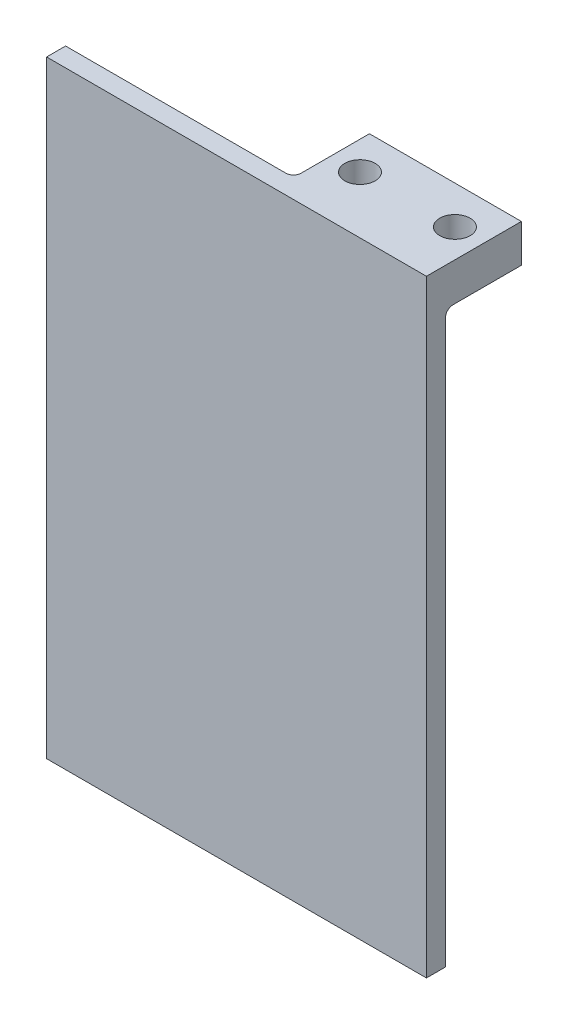
ISO-10303-21;
HEADER;
FILE_DESCRIPTION(('STEP AP214'),'2;1');
FILE_NAME('part.step','',(''),(''),'','','');
FILE_SCHEMA(('AUTOMOTIVE_DESIGN { 1 0 10303 214 1 1 1 1 }'));
ENDSEC;
DATA;
#1=APPLICATION_CONTEXT('core data for automotive mechanical design processes');
#2=APPLICATION_PROTOCOL_DEFINITION('international standard','automotive_design',2000,#1);
#3=PRODUCT_CONTEXT('',#1,'mechanical');
#4=PRODUCT('Part','Part','',(#3));
#5=PRODUCT_RELATED_PRODUCT_CATEGORY('part','',(#4));
#6=PRODUCT_DEFINITION_FORMATION('','',#4);
#7=PRODUCT_DEFINITION_CONTEXT('part definition',#1,'design');
#8=PRODUCT_DEFINITION('design','',#6,#7);
#9=PRODUCT_DEFINITION_SHAPE('','',#8);
#10=(LENGTH_UNIT() NAMED_UNIT(*) SI_UNIT(.MILLI.,.METRE.));
#11=(NAMED_UNIT(*) PLANE_ANGLE_UNIT() SI_UNIT($,.RADIAN.));
#12=(NAMED_UNIT(*) SI_UNIT($,.STERADIAN.) SOLID_ANGLE_UNIT());
#13=UNCERTAINTY_MEASURE_WITH_UNIT(LENGTH_MEASURE(1.E-05),#10,'distance_accuracy_value','');
#14=(GEOMETRIC_REPRESENTATION_CONTEXT(3) GLOBAL_UNCERTAINTY_ASSIGNED_CONTEXT((#13)) GLOBAL_UNIT_ASSIGNED_CONTEXT((#10,
#11,#12)) REPRESENTATION_CONTEXT('',''));
#15=CARTESIAN_POINT('',(0.,0.,0.));
#16=DIRECTION('',(0.,0.,1.));
#17=DIRECTION('',(1.,0.,0.));
#18=AXIS2_PLACEMENT_3D('',#15,#16,#17);
#19=CARTESIAN_POINT('',(0.,0.,0.));
#20=DIRECTION('',(0.,0.,1.));
#21=DIRECTION('',(1.,0.,0.));
#22=AXIS2_PLACEMENT_3D('',#19,#20,#21);
#23=PLANE('',#22);
#24=DIRECTION('',(0.,1.,0.));
#25=VECTOR('',#24,1.);
#26=CARTESIAN_POINT('',(7.99999999999999,0.,0.));
#27=LINE('',#26,#25);
#28=CARTESIAN_POINT('',(7.99999999999999,80.,0.));
#29=VERTEX_POINT('',#28);
#30=CARTESIAN_POINT('',(7.99999999999999,68.,0.));
#31=VERTEX_POINT('',#30);
#32=EDGE_CURVE('E185',#29,#31,#27,.F.);
#33=ORIENTED_EDGE('',*,*,#32,.T.);
#34=DIRECTION('',(1.,0.,0.));
#35=VECTOR('',#34,1.);
#36=CARTESIAN_POINT('',(50.,68.,0.));
#37=LINE('',#36,#35);
#38=CARTESIAN_POINT('',(50.,68.,0.));
#39=VERTEX_POINT('',#38);
#40=EDGE_CURVE('E188',#31,#39,#37,.T.);
#41=ORIENTED_EDGE('',*,*,#40,.T.);
#42=DIRECTION('',(0.,1.,0.));
#43=VECTOR('',#42,1.);
#44=CARTESIAN_POINT('',(50.,80.,0.));
#45=LINE('',#44,#43);
#46=CARTESIAN_POINT('',(50.,-80.,0.));
#47=VERTEX_POINT('',#46);
#48=EDGE_CURVE('E144',#47,#39,#45,.T.);
#49=ORIENTED_EDGE('',*,*,#48,.F.);
#50=DIRECTION('',(1.,0.,0.));
#51=VECTOR('',#50,1.);
#52=CARTESIAN_POINT('',(-50.,-80.,0.));
#53=LINE('',#52,#51);
#54=CARTESIAN_POINT('',(-50.,-80.,0.));
#55=VERTEX_POINT('',#54);
#56=EDGE_CURVE('E151',#55,#47,#53,.T.);
#57=ORIENTED_EDGE('',*,*,#56,.F.);
#58=DIRECTION('',(0.,-1.,0.));
#59=VECTOR('',#58,1.);
#60=CARTESIAN_POINT('',(-50.,80.,0.));
#61=LINE('',#60,#59);
#62=CARTESIAN_POINT('',(-50.,80.,0.));
#63=VERTEX_POINT('',#62);
#64=EDGE_CURVE('E166',#63,#55,#61,.T.);
#65=ORIENTED_EDGE('',*,*,#64,.F.);
#66=DIRECTION('',(-1.,0.,0.));
#67=VECTOR('',#66,1.);
#68=CARTESIAN_POINT('',(-50.,80.,0.));
#69=LINE('',#68,#67);
#70=EDGE_CURVE('E163',#29,#63,#69,.T.);
#71=ORIENTED_EDGE('',*,*,#70,.F.);
#72=EDGE_LOOP('',(#33,#41,#49,#57,#65,#71));
#73=FACE_BOUND('',#72,.T.);
#74=ADVANCED_FACE('F39',(#73),#23,.F.);
#75=CARTESIAN_POINT('',(50.,80.,5.));
#76=DIRECTION('',(-1.,0.,0.));
#77=DIRECTION('',(0.,0.,1.));
#78=AXIS2_PLACEMENT_3D('',#75,#76,#77);
#79=PLANE('',#78);
#80=ORIENTED_EDGE('',*,*,#48,.T.);
#81=CARTESIAN_POINT('',(50.,68.,-2.));
#82=DIRECTION('',(-1.,0.,0.));
#83=DIRECTION('',(0.,0.,1.));
#84=AXIS2_PLACEMENT_3D('',#81,#82,#83);
#85=CIRCLE('',#84,2.);
#86=CARTESIAN_POINT('',(50.,70.,-2.));
#87=VERTEX_POINT('',#86);
#88=EDGE_CURVE('E49',#39,#87,#85,.T.);
#89=ORIENTED_EDGE('',*,*,#88,.T.);
#90=DIRECTION('',(0.,0.,-1.));
#91=VECTOR('',#90,1.);
#92=CARTESIAN_POINT('',(50.,70.,0.));
#93=LINE('',#92,#91);
#94=CARTESIAN_POINT('',(50.,70.,-20.));
#95=VERTEX_POINT('',#94);
#96=EDGE_CURVE('E110',#87,#95,#93,.T.);
#97=ORIENTED_EDGE('',*,*,#96,.T.);
#98=DIRECTION('',(0.,1.,0.));
#99=VECTOR('',#98,1.);
#100=CARTESIAN_POINT('',(50.,70.,-20.));
#101=LINE('',#100,#99);
#102=CARTESIAN_POINT('',(50.,80.,-20.));
#103=VERTEX_POINT('',#102);
#104=EDGE_CURVE('E115',#95,#103,#101,.T.);
#105=ORIENTED_EDGE('',*,*,#104,.T.);
#106=DIRECTION('',(0.,0.,-1.));
#107=VECTOR('',#106,1.);
#108=CARTESIAN_POINT('',(50.,80.,5.));
#109=LINE('',#108,#107);
#110=CARTESIAN_POINT('',(50.,80.,5.));
#111=VERTEX_POINT('',#110);
#112=EDGE_CURVE('E182',#111,#103,#109,.T.);
#113=ORIENTED_EDGE('',*,*,#112,.F.);
#114=DIRECTION('',(0.,1.,0.));
#115=VECTOR('',#114,1.);
#116=CARTESIAN_POINT('',(50.,80.,5.));
#117=LINE('',#116,#115);
#118=CARTESIAN_POINT('',(50.,-80.,5.));
#119=VERTEX_POINT('',#118);
#120=EDGE_CURVE('E146',#119,#111,#117,.T.);
#121=ORIENTED_EDGE('',*,*,#120,.F.);
#122=DIRECTION('',(0.,0.,-1.));
#123=VECTOR('',#122,1.);
#124=CARTESIAN_POINT('',(50.,-80.,5.));
#125=LINE('',#124,#123);
#126=EDGE_CURVE('E160',#119,#47,#125,.T.);
#127=ORIENTED_EDGE('',*,*,#126,.T.);
#128=EDGE_LOOP('',(#80,#89,#97,#105,#113,#121,#127));
#129=FACE_BOUND('',#128,.T.);
#130=ADVANCED_FACE('F113',(#129),#79,.F.);
#131=CARTESIAN_POINT('',(-50.,80.,5.));
#132=DIRECTION('',(0.,-1.,0.));
#133=DIRECTION('',(0.,0.,-1.));
#134=AXIS2_PLACEMENT_3D('',#131,#132,#133);
#135=PLANE('',#134);
#136=CARTESIAN_POINT('',(17.5,80.,-9.99999999999999));
#137=DIRECTION('',(0.,1.,0.));
#138=DIRECTION('',(0.,0.,1.));
#139=AXIS2_PLACEMENT_3D('',#136,#137,#138);
#140=CIRCLE('',#139,4.);
#141=CARTESIAN_POINT('',(17.5,80.,-6.));
#142=VERTEX_POINT('',#141);
#143=EDGE_CURVE('E230',#142,#142,#140,.T.);
#144=ORIENTED_EDGE('',*,*,#143,.F.);
#145=EDGE_LOOP('',(#144));
#146=FACE_BOUND('',#145,.T.);
#147=CARTESIAN_POINT('',(42.5,80.,-9.99999999999999));
#148=DIRECTION('',(0.,1.,0.));
#149=DIRECTION('',(0.,0.,1.));
#150=AXIS2_PLACEMENT_3D('',#147,#148,#149);
#151=CIRCLE('',#150,4.00000000000001);
#152=CARTESIAN_POINT('',(42.5,80.,-5.99999999999999));
#153=VERTEX_POINT('',#152);
#154=EDGE_CURVE('E222',#153,#153,#151,.T.);
#155=ORIENTED_EDGE('',*,*,#154,.F.);
#156=EDGE_LOOP('',(#155));
#157=FACE_BOUND('',#156,.T.);
#158=ORIENTED_EDGE('',*,*,#112,.T.);
#159=DIRECTION('',(-1.,0.,0.));
#160=VECTOR('',#159,1.);
#161=CARTESIAN_POINT('',(50.,80.,-20.));
#162=LINE('',#161,#160);
#163=CARTESIAN_POINT('',(9.99999999999999,80.,-20.));
#164=VERTEX_POINT('',#163);
#165=EDGE_CURVE('E126',#103,#164,#162,.T.);
#166=ORIENTED_EDGE('',*,*,#165,.T.);
#167=DIRECTION('',(0.,0.,1.));
#168=VECTOR('',#167,1.);
#169=CARTESIAN_POINT('',(9.99999999999999,80.,0.));
#170=LINE('',#169,#168);
#171=CARTESIAN_POINT('',(9.99999999999999,80.,-2.));
#172=VERTEX_POINT('',#171);
#173=EDGE_CURVE('E120',#164,#172,#170,.T.);
#174=ORIENTED_EDGE('',*,*,#173,.T.);
#175=CARTESIAN_POINT('',(7.99999999999999,80.,-2.));
#176=DIRECTION('',(0.,-1.,0.));
#177=DIRECTION('',(0.,0.,-1.));
#178=AXIS2_PLACEMENT_3D('',#175,#176,#177);
#179=CIRCLE('',#178,2.);
#180=EDGE_CURVE('E11',#172,#29,#179,.T.);
#181=ORIENTED_EDGE('',*,*,#180,.T.);
#182=ORIENTED_EDGE('',*,*,#70,.T.);
#183=DIRECTION('',(0.,0.,-1.));
#184=VECTOR('',#183,1.);
#185=CARTESIAN_POINT('',(-50.,80.,5.));
#186=LINE('',#185,#184);
#187=CARTESIAN_POINT('',(-50.,80.,5.));
#188=VERTEX_POINT('',#187);
#189=EDGE_CURVE('E178',#188,#63,#186,.T.);
#190=ORIENTED_EDGE('',*,*,#189,.F.);
#191=DIRECTION('',(-1.,0.,0.));
#192=VECTOR('',#191,1.);
#193=CARTESIAN_POINT('',(-50.,80.,5.));
#194=LINE('',#193,#192);
#195=EDGE_CURVE('E150',#111,#188,#194,.T.);
#196=ORIENTED_EDGE('',*,*,#195,.F.);
#197=EDGE_LOOP('',(#158,#166,#174,#181,#182,#190,#196));
#198=FACE_BOUND('',#197,.T.);
#199=ADVANCED_FACE('F218',(#146,#157,#198),#135,.F.);
#200=CARTESIAN_POINT('',(-50.,80.,5.));
#201=DIRECTION('',(1.,0.,0.));
#202=DIRECTION('',(0.,0.,-1.));
#203=AXIS2_PLACEMENT_3D('',#200,#201,#202);
#204=PLANE('',#203);
#205=ORIENTED_EDGE('',*,*,#64,.T.);
#206=DIRECTION('',(0.,0.,-1.));
#207=VECTOR('',#206,1.);
#208=CARTESIAN_POINT('',(-50.,-80.,5.));
#209=LINE('',#208,#207);
#210=CARTESIAN_POINT('',(-50.,-80.,5.));
#211=VERTEX_POINT('',#210);
#212=EDGE_CURVE('E174',#211,#55,#209,.T.);
#213=ORIENTED_EDGE('',*,*,#212,.F.);
#214=DIRECTION('',(0.,-1.,0.));
#215=VECTOR('',#214,1.);
#216=CARTESIAN_POINT('',(-50.,80.,5.));
#217=LINE('',#216,#215);
#218=EDGE_CURVE('E154',#188,#211,#217,.T.);
#219=ORIENTED_EDGE('',*,*,#218,.F.);
#220=ORIENTED_EDGE('',*,*,#189,.T.);
#221=EDGE_LOOP('',(#205,#213,#219,#220));
#222=FACE_BOUND('',#221,.T.);
#223=ADVANCED_FACE('F214',(#222),#204,.F.);
#224=CARTESIAN_POINT('',(-50.,-80.,5.));
#225=DIRECTION('',(0.,1.,0.));
#226=DIRECTION('',(0.,0.,1.));
#227=AXIS2_PLACEMENT_3D('',#224,#225,#226);
#228=PLANE('',#227);
#229=ORIENTED_EDGE('',*,*,#56,.T.);
#230=ORIENTED_EDGE('',*,*,#126,.F.);
#231=DIRECTION('',(1.,0.,0.));
#232=VECTOR('',#231,1.);
#233=CARTESIAN_POINT('',(-50.,-80.,5.));
#234=LINE('',#233,#232);
#235=EDGE_CURVE('E157',#211,#119,#234,.T.);
#236=ORIENTED_EDGE('',*,*,#235,.F.);
#237=ORIENTED_EDGE('',*,*,#212,.T.);
#238=EDGE_LOOP('',(#229,#230,#236,#237));
#239=FACE_BOUND('',#238,.T.);
#240=ADVANCED_FACE('F210',(#239),#228,.F.);
#241=CARTESIAN_POINT('',(0.,0.,5.));
#242=DIRECTION('',(0.,0.,1.));
#243=DIRECTION('',(1.,0.,0.));
#244=AXIS2_PLACEMENT_3D('',#241,#242,#243);
#245=PLANE('',#244);
#246=ORIENTED_EDGE('',*,*,#120,.T.);
#247=ORIENTED_EDGE('',*,*,#195,.T.);
#248=ORIENTED_EDGE('',*,*,#218,.T.);
#249=ORIENTED_EDGE('',*,*,#235,.T.);
#250=EDGE_LOOP('',(#246,#247,#248,#249));
#251=FACE_BOUND('',#250,.T.);
#252=ADVANCED_FACE('F264',(#251),#245,.T.);
#253=CARTESIAN_POINT('',(9.99999999999999,70.,0.));
#254=DIRECTION('',(-1.,0.,0.));
#255=DIRECTION('',(0.,0.,1.));
#256=AXIS2_PLACEMENT_3D('',#253,#254,#255);
#257=PLANE('',#256);
#258=DIRECTION('',(0.,0.,1.));
#259=VECTOR('',#258,1.);
#260=CARTESIAN_POINT('',(9.99999999999999,70.,0.));
#261=LINE('',#260,#259);
#262=CARTESIAN_POINT('',(9.99999999999999,70.,-20.));
#263=VERTEX_POINT('',#262);
#264=CARTESIAN_POINT('',(9.99999999999999,70.,-2.));
#265=VERTEX_POINT('',#264);
#266=EDGE_CURVE('E129',#263,#265,#261,.T.);
#267=ORIENTED_EDGE('',*,*,#266,.T.);
#268=DIRECTION('',(0.,1.,0.));
#269=VECTOR('',#268,1.);
#270=CARTESIAN_POINT('',(9.99999999999999,70.,-2.));
#271=LINE('',#270,#269);
#272=EDGE_CURVE('E56',#265,#172,#271,.T.);
#273=ORIENTED_EDGE('',*,*,#272,.T.);
#274=ORIENTED_EDGE('',*,*,#173,.F.);
#275=DIRECTION('',(0.,1.,0.));
#276=VECTOR('',#275,1.);
#277=CARTESIAN_POINT('',(9.99999999999999,70.,-20.));
#278=LINE('',#277,#276);
#279=EDGE_CURVE('E128',#263,#164,#278,.T.);
#280=ORIENTED_EDGE('',*,*,#279,.F.);
#281=EDGE_LOOP('',(#267,#273,#274,#280));
#282=FACE_BOUND('',#281,.T.);
#283=ADVANCED_FACE('F270',(#282),#257,.T.);
#284=CARTESIAN_POINT('',(50.,70.,-20.));
#285=DIRECTION('',(0.,0.,-1.));
#286=DIRECTION('',(-1.,0.,0.));
#287=AXIS2_PLACEMENT_3D('',#284,#285,#286);
#288=PLANE('',#287);
#289=ORIENTED_EDGE('',*,*,#165,.F.);
#290=ORIENTED_EDGE('',*,*,#104,.F.);
#291=DIRECTION('',(-1.,0.,0.));
#292=VECTOR('',#291,1.);
#293=CARTESIAN_POINT('',(50.,70.,-20.));
#294=LINE('',#293,#292);
#295=EDGE_CURVE('E119',#95,#263,#294,.T.);
#296=ORIENTED_EDGE('',*,*,#295,.T.);
#297=ORIENTED_EDGE('',*,*,#279,.T.);
#298=EDGE_LOOP('',(#289,#290,#296,#297));
#299=FACE_BOUND('',#298,.T.);
#300=ADVANCED_FACE('F124',(#299),#288,.T.);
#301=CARTESIAN_POINT('',(0.,70.,0.));
#302=DIRECTION('',(0.,1.,0.));
#303=DIRECTION('',(0.,0.,1.));
#304=AXIS2_PLACEMENT_3D('',#301,#302,#303);
#305=PLANE('',#304);
#306=CARTESIAN_POINT('',(17.5,70.,-9.99999999999999));
#307=DIRECTION('',(0.,1.,0.));
#308=DIRECTION('',(0.,0.,1.));
#309=AXIS2_PLACEMENT_3D('',#306,#307,#308);
#310=CIRCLE('',#309,4.);
#311=CARTESIAN_POINT('',(17.5,70.,-6.));
#312=VERTEX_POINT('',#311);
#313=EDGE_CURVE('E140',#312,#312,#310,.T.);
#314=ORIENTED_EDGE('',*,*,#313,.T.);
#315=EDGE_LOOP('',(#314));
#316=FACE_BOUND('',#315,.T.);
#317=CARTESIAN_POINT('',(42.5,70.,-9.99999999999999));
#318=DIRECTION('',(0.,1.,0.));
#319=DIRECTION('',(0.,0.,1.));
#320=AXIS2_PLACEMENT_3D('',#317,#318,#319);
#321=CIRCLE('',#320,4.00000000000001);
#322=CARTESIAN_POINT('',(42.5,70.,-5.99999999999999));
#323=VERTEX_POINT('',#322);
#324=EDGE_CURVE('E225',#323,#323,#321,.T.);
#325=ORIENTED_EDGE('',*,*,#324,.T.);
#326=EDGE_LOOP('',(#325));
#327=FACE_BOUND('',#326,.T.);
#328=ORIENTED_EDGE('',*,*,#96,.F.);
#329=DIRECTION('',(1.,0.,0.));
#330=VECTOR('',#329,1.);
#331=CARTESIAN_POINT('',(9.99999999999999,70.,-2.));
#332=LINE('',#331,#330);
#333=EDGE_CURVE('E64',#87,#265,#332,.F.);
#334=ORIENTED_EDGE('',*,*,#333,.T.);
#335=ORIENTED_EDGE('',*,*,#266,.F.);
#336=ORIENTED_EDGE('',*,*,#295,.F.);
#337=EDGE_LOOP('',(#328,#334,#335,#336));
#338=FACE_BOUND('',#337,.T.);
#339=ADVANCED_FACE('F131',(#316,#327,#338),#305,.F.);
#340=CARTESIAN_POINT('',(42.5,70.,-9.99999999999999));
#341=DIRECTION('',(0.,1.,0.));
#342=DIRECTION('',(0.,0.,1.));
#343=AXIS2_PLACEMENT_3D('',#340,#341,#342);
#344=CYLINDRICAL_SURFACE('',#343,4.00000000000001);
#345=ORIENTED_EDGE('',*,*,#324,.F.);
#346=EDGE_LOOP('',(#345));
#347=FACE_BOUND('',#346,.T.);
#348=ORIENTED_EDGE('',*,*,#154,.T.);
#349=EDGE_LOOP('',(#348));
#350=FACE_BOUND('',#349,.T.);
#351=ADVANCED_FACE('F245',(#347,#350),#344,.F.);
#352=CARTESIAN_POINT('',(17.5,70.,-9.99999999999999));
#353=DIRECTION('',(0.,1.,0.));
#354=DIRECTION('',(0.,0.,1.));
#355=AXIS2_PLACEMENT_3D('',#352,#353,#354);
#356=CYLINDRICAL_SURFACE('',#355,4.);
#357=ORIENTED_EDGE('',*,*,#313,.F.);
#358=EDGE_LOOP('',(#357));
#359=FACE_BOUND('',#358,.T.);
#360=ORIENTED_EDGE('',*,*,#143,.T.);
#361=EDGE_LOOP('',(#360));
#362=FACE_BOUND('',#361,.T.);
#363=ADVANCED_FACE('F242',(#359,#362),#356,.F.);
#364=CARTESIAN_POINT('',(7.99999999999999,70.,-2.));
#365=DIRECTION('',(0.,1.,0.));
#366=DIRECTION('',(0.,0.,1.));
#367=AXIS2_PLACEMENT_3D('',#364,#365,#366);
#368=CYLINDRICAL_SURFACE('',#367,2.);
#369=ORIENTED_EDGE('',*,*,#180,.F.);
#370=ORIENTED_EDGE('',*,*,#272,.F.);
#371=CARTESIAN_POINT('',(7.99999999999999,68.,-2.));
#372=DIRECTION('',(-0.707106781186547,0.707106781186547,0.));
#373=DIRECTION('',(0.707106781186547,0.707106781186547,0.));
#374=AXIS2_PLACEMENT_3D('',#371,#372,#373);
#375=ELLIPSE('',#374,2.82842712474619,2.);
#376=EDGE_CURVE('E43',#31,#265,#375,.T.);
#377=ORIENTED_EDGE('',*,*,#376,.F.);
#378=ORIENTED_EDGE('',*,*,#32,.F.);
#379=EDGE_LOOP('',(#369,#370,#377,#378));
#380=FACE_BOUND('',#379,.T.);
#381=ADVANCED_FACE('F41',(#380),#368,.F.);
#382=CARTESIAN_POINT('',(0.,68.,-2.));
#383=DIRECTION('',(-1.,0.,0.));
#384=DIRECTION('',(0.,0.,1.));
#385=AXIS2_PLACEMENT_3D('',#382,#383,#384);
#386=CYLINDRICAL_SURFACE('',#385,2.);
#387=ORIENTED_EDGE('',*,*,#376,.T.);
#388=ORIENTED_EDGE('',*,*,#333,.F.);
#389=ORIENTED_EDGE('',*,*,#88,.F.);
#390=ORIENTED_EDGE('',*,*,#40,.F.);
#391=EDGE_LOOP('',(#387,#388,#389,#390));
#392=FACE_BOUND('',#391,.T.);
#393=ADVANCED_FACE('F300',(#392),#386,.F.);
#394=CLOSED_SHELL('',(#74,#130,#199,#223,#240,#252,#283,#300,#339,#351,#363,#381,#393));
#395=MANIFOLD_SOLID_BREP('B2',#394);
#396=ADVANCED_BREP_SHAPE_REPRESENTATION('',(#18,#395),#14);
#397=SHAPE_DEFINITION_REPRESENTATION(#9,#396);
ENDSEC;
END-ISO-10303-21;
